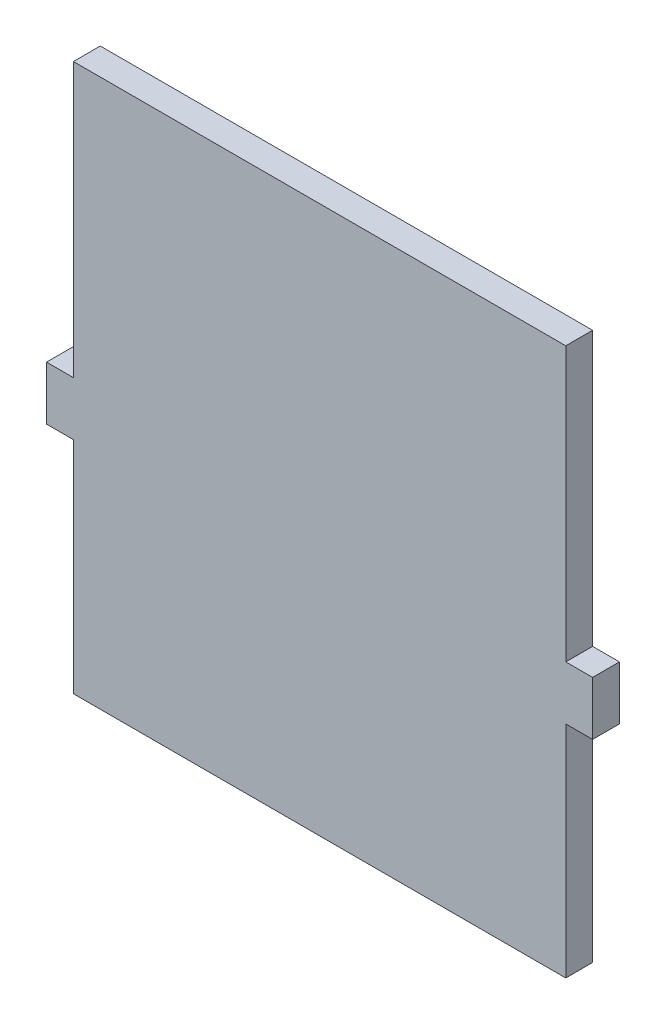
ISO-10303-21;
HEADER;
FILE_DESCRIPTION(('STEP AP214'),'2;1');
FILE_NAME('part.step','',(''),(''),'','','');
FILE_SCHEMA(('AUTOMOTIVE_DESIGN { 1 0 10303 214 1 1 1 1 }'));
ENDSEC;
DATA;
#1=APPLICATION_CONTEXT('core data for automotive mechanical design processes');
#2=APPLICATION_PROTOCOL_DEFINITION('international standard','automotive_design',2000,#1);
#3=PRODUCT_CONTEXT('',#1,'mechanical');
#4=PRODUCT('Part','Part','',(#3));
#5=PRODUCT_RELATED_PRODUCT_CATEGORY('part','',(#4));
#6=PRODUCT_DEFINITION_FORMATION('','',#4);
#7=PRODUCT_DEFINITION_CONTEXT('part definition',#1,'design');
#8=PRODUCT_DEFINITION('design','',#6,#7);
#9=PRODUCT_DEFINITION_SHAPE('','',#8);
#10=(LENGTH_UNIT() NAMED_UNIT(*) SI_UNIT(.MILLI.,.METRE.));
#11=(NAMED_UNIT(*) PLANE_ANGLE_UNIT() SI_UNIT($,.RADIAN.));
#12=(NAMED_UNIT(*) SI_UNIT($,.STERADIAN.) SOLID_ANGLE_UNIT());
#13=UNCERTAINTY_MEASURE_WITH_UNIT(LENGTH_MEASURE(1.E-05),#10,'distance_accuracy_value','');
#14=(GEOMETRIC_REPRESENTATION_CONTEXT(3) GLOBAL_UNCERTAINTY_ASSIGNED_CONTEXT((#13)) GLOBAL_UNIT_ASSIGNED_CONTEXT((#10,
#11,#12)) REPRESENTATION_CONTEXT('',''));
#15=CARTESIAN_POINT('',(0.,0.,0.));
#16=DIRECTION('',(0.,0.,1.));
#17=DIRECTION('',(1.,0.,0.));
#18=AXIS2_PLACEMENT_3D('',#15,#16,#17);
#19=CARTESIAN_POINT('',(0.,0.,3.));
#20=DIRECTION('',(1.,0.,0.));
#21=DIRECTION('',(0.,1.,0.));
#22=AXIS2_PLACEMENT_3D('',#19,#20,#21);
#23=PLANE('',#22);
#24=DIRECTION('',(0.,-1.,0.));
#25=VECTOR('',#24,1.);
#26=CARTESIAN_POINT('',(0.,0.,0.));
#27=LINE('',#26,#25);
#28=CARTESIAN_POINT('',(0.,0.,0.));
#29=VERTEX_POINT('',#28);
#30=CARTESIAN_POINT('',(0.,-30.58,0.));
#31=VERTEX_POINT('',#30);
#32=EDGE_CURVE('E159',#29,#31,#27,.T.);
#33=ORIENTED_EDGE('',*,*,#32,.T.);
#34=DIRECTION('',(0.,0.,-1.));
#35=VECTOR('',#34,1.);
#36=CARTESIAN_POINT('',(0.,-30.58,3.));
#37=LINE('',#36,#35);
#38=CARTESIAN_POINT('',(0.,-30.58,3.));
#39=VERTEX_POINT('',#38);
#40=EDGE_CURVE('E11',#39,#31,#37,.T.);
#41=ORIENTED_EDGE('',*,*,#40,.F.);
#42=DIRECTION('',(0.,-1.,0.));
#43=VECTOR('',#42,1.);
#44=CARTESIAN_POINT('',(0.,0.,3.));
#45=LINE('',#44,#43);
#46=CARTESIAN_POINT('',(0.,0.,3.));
#47=VERTEX_POINT('',#46);
#48=EDGE_CURVE('E181',#47,#39,#45,.T.);
#49=ORIENTED_EDGE('',*,*,#48,.F.);
#50=DIRECTION('',(0.,0.,-1.));
#51=VECTOR('',#50,1.);
#52=CARTESIAN_POINT('',(0.,0.,3.));
#53=LINE('',#52,#51);
#54=EDGE_CURVE('E155',#47,#29,#53,.T.);
#55=ORIENTED_EDGE('',*,*,#54,.T.);
#56=EDGE_LOOP('',(#33,#41,#49,#55));
#57=FACE_BOUND('',#56,.T.);
#58=ADVANCED_FACE('F39',(#57),#23,.F.);
#59=CARTESIAN_POINT('',(0.,-30.58,3.));
#60=DIRECTION('',(0.,-1.,0.));
#61=DIRECTION('',(0.,0.,-1.));
#62=AXIS2_PLACEMENT_3D('',#59,#60,#61);
#63=PLANE('',#62);
#64=DIRECTION('',(-1.,0.,0.));
#65=VECTOR('',#64,1.);
#66=CARTESIAN_POINT('',(0.,-30.58,0.));
#67=LINE('',#66,#65);
#68=CARTESIAN_POINT('',(-2.99999999999999,-30.58,0.));
#69=VERTEX_POINT('',#68);
#70=EDGE_CURVE('E162',#31,#69,#67,.T.);
#71=ORIENTED_EDGE('',*,*,#70,.T.);
#72=DIRECTION('',(0.,0.,-1.));
#73=VECTOR('',#72,1.);
#74=CARTESIAN_POINT('',(-2.99999999999999,-30.58,3.));
#75=LINE('',#74,#73);
#76=CARTESIAN_POINT('',(-2.99999999999999,-30.58,3.));
#77=VERTEX_POINT('',#76);
#78=EDGE_CURVE('E47',#77,#69,#75,.T.);
#79=ORIENTED_EDGE('',*,*,#78,.F.);
#80=DIRECTION('',(-1.,0.,0.));
#81=VECTOR('',#80,1.);
#82=CARTESIAN_POINT('',(0.,-30.58,3.));
#83=LINE('',#82,#81);
#84=EDGE_CURVE('E110',#39,#77,#83,.T.);
#85=ORIENTED_EDGE('',*,*,#84,.F.);
#86=ORIENTED_EDGE('',*,*,#40,.T.);
#87=EDGE_LOOP('',(#71,#79,#85,#86));
#88=FACE_BOUND('',#87,.T.);
#89=ADVANCED_FACE('F259',(#88),#63,.F.);
#90=CARTESIAN_POINT('',(-2.99999999999999,-30.58,3.));
#91=DIRECTION('',(1.,0.,0.));
#92=DIRECTION('',(0.,1.,0.));
#93=AXIS2_PLACEMENT_3D('',#90,#91,#92);
#94=PLANE('',#93);
#95=DIRECTION('',(0.,-1.,0.));
#96=VECTOR('',#95,1.);
#97=CARTESIAN_POINT('',(-2.99999999999999,-30.58,0.));
#98=LINE('',#97,#96);
#99=CARTESIAN_POINT('',(-2.99999999999999,-36.58,0.));
#100=VERTEX_POINT('',#99);
#101=EDGE_CURVE('E164',#69,#100,#98,.T.);
#102=ORIENTED_EDGE('',*,*,#101,.T.);
#103=DIRECTION('',(0.,0.,-1.));
#104=VECTOR('',#103,1.);
#105=CARTESIAN_POINT('',(-2.99999999999999,-36.58,3.));
#106=LINE('',#105,#104);
#107=CARTESIAN_POINT('',(-2.99999999999999,-36.58,3.));
#108=VERTEX_POINT('',#107);
#109=EDGE_CURVE('E200',#108,#100,#106,.T.);
#110=ORIENTED_EDGE('',*,*,#109,.F.);
#111=DIRECTION('',(0.,-1.,0.));
#112=VECTOR('',#111,1.);
#113=CARTESIAN_POINT('',(-2.99999999999999,-30.58,3.));
#114=LINE('',#113,#112);
#115=EDGE_CURVE('E208',#77,#108,#114,.T.);
#116=ORIENTED_EDGE('',*,*,#115,.F.);
#117=ORIENTED_EDGE('',*,*,#78,.T.);
#118=EDGE_LOOP('',(#102,#110,#116,#117));
#119=FACE_BOUND('',#118,.T.);
#120=ADVANCED_FACE('F206',(#119),#94,.F.);
#121=CARTESIAN_POINT('',(0.,-36.58,3.));
#122=DIRECTION('',(0.,1.,0.));
#123=DIRECTION('',(0.,0.,1.));
#124=AXIS2_PLACEMENT_3D('',#121,#122,#123);
#125=PLANE('',#124);
#126=DIRECTION('',(1.,0.,0.));
#127=VECTOR('',#126,1.);
#128=CARTESIAN_POINT('',(0.,-36.58,0.));
#129=LINE('',#128,#127);
#130=CARTESIAN_POINT('',(0.,-36.58,0.));
#131=VERTEX_POINT('',#130);
#132=EDGE_CURVE('E166',#100,#131,#129,.T.);
#133=ORIENTED_EDGE('',*,*,#132,.T.);
#134=DIRECTION('',(0.,0.,-1.));
#135=VECTOR('',#134,1.);
#136=CARTESIAN_POINT('',(0.,-36.58,3.));
#137=LINE('',#136,#135);
#138=CARTESIAN_POINT('',(0.,-36.58,3.));
#139=VERTEX_POINT('',#138);
#140=EDGE_CURVE('E197',#139,#131,#137,.T.);
#141=ORIENTED_EDGE('',*,*,#140,.F.);
#142=DIRECTION('',(1.,0.,0.));
#143=VECTOR('',#142,1.);
#144=CARTESIAN_POINT('',(0.,-36.58,3.));
#145=LINE('',#144,#143);
#146=EDGE_CURVE('E226',#108,#139,#145,.T.);
#147=ORIENTED_EDGE('',*,*,#146,.F.);
#148=ORIENTED_EDGE('',*,*,#109,.T.);
#149=EDGE_LOOP('',(#133,#141,#147,#148));
#150=FACE_BOUND('',#149,.T.);
#151=ADVANCED_FACE('F217',(#150),#125,.F.);
#152=CARTESIAN_POINT('',(0.,-36.58,3.));
#153=DIRECTION('',(1.,0.,0.));
#154=DIRECTION('',(0.,1.,0.));
#155=AXIS2_PLACEMENT_3D('',#152,#153,#154);
#156=PLANE('',#155);
#157=DIRECTION('',(0.,-1.,0.));
#158=VECTOR('',#157,1.);
#159=CARTESIAN_POINT('',(0.,-36.58,0.));
#160=LINE('',#159,#158);
#161=CARTESIAN_POINT('',(0.,-61.16,0.));
#162=VERTEX_POINT('',#161);
#163=EDGE_CURVE('E168',#131,#162,#160,.T.);
#164=ORIENTED_EDGE('',*,*,#163,.T.);
#165=DIRECTION('',(0.,0.,-1.));
#166=VECTOR('',#165,1.);
#167=CARTESIAN_POINT('',(0.,-61.16,3.));
#168=LINE('',#167,#166);
#169=CARTESIAN_POINT('',(0.,-61.16,3.));
#170=VERTEX_POINT('',#169);
#171=EDGE_CURVE('E194',#170,#162,#168,.T.);
#172=ORIENTED_EDGE('',*,*,#171,.F.);
#173=DIRECTION('',(0.,-1.,0.));
#174=VECTOR('',#173,1.);
#175=CARTESIAN_POINT('',(0.,-36.58,3.));
#176=LINE('',#175,#174);
#177=EDGE_CURVE('E223',#139,#170,#176,.T.);
#178=ORIENTED_EDGE('',*,*,#177,.F.);
#179=ORIENTED_EDGE('',*,*,#140,.T.);
#180=EDGE_LOOP('',(#164,#172,#178,#179));
#181=FACE_BOUND('',#180,.T.);
#182=ADVANCED_FACE('F221',(#181),#156,.F.);
#183=CARTESIAN_POINT('',(0.,-61.16,3.));
#184=DIRECTION('',(0.,1.,0.));
#185=DIRECTION('',(-1.,0.,0.));
#186=AXIS2_PLACEMENT_3D('',#183,#184,#185);
#187=PLANE('',#186);
#188=DIRECTION('',(1.,0.,0.));
#189=VECTOR('',#188,1.);
#190=CARTESIAN_POINT('',(0.,-61.16,0.));
#191=LINE('',#190,#189);
#192=CARTESIAN_POINT('',(55.,-61.16,0.));
#193=VERTEX_POINT('',#192);
#194=EDGE_CURVE('E170',#162,#193,#191,.T.);
#195=ORIENTED_EDGE('',*,*,#194,.T.);
#196=DIRECTION('',(0.,0.,-1.));
#197=VECTOR('',#196,1.);
#198=CARTESIAN_POINT('',(55.,-61.16,3.));
#199=LINE('',#198,#197);
#200=CARTESIAN_POINT('',(55.,-61.16,3.));
#201=VERTEX_POINT('',#200);
#202=EDGE_CURVE('E191',#201,#193,#199,.T.);
#203=ORIENTED_EDGE('',*,*,#202,.F.);
#204=DIRECTION('',(1.,0.,0.));
#205=VECTOR('',#204,1.);
#206=CARTESIAN_POINT('',(0.,-61.16,3.));
#207=LINE('',#206,#205);
#208=EDGE_CURVE('E225',#170,#201,#207,.T.);
#209=ORIENTED_EDGE('',*,*,#208,.F.);
#210=ORIENTED_EDGE('',*,*,#171,.T.);
#211=EDGE_LOOP('',(#195,#203,#209,#210));
#212=FACE_BOUND('',#211,.T.);
#213=ADVANCED_FACE('F272',(#212),#187,.F.);
#214=CARTESIAN_POINT('',(55.,-36.58,3.));
#215=DIRECTION('',(-1.,0.,0.));
#216=DIRECTION('',(0.,0.,1.));
#217=AXIS2_PLACEMENT_3D('',#214,#215,#216);
#218=PLANE('',#217);
#219=DIRECTION('',(0.,1.,0.));
#220=VECTOR('',#219,1.);
#221=CARTESIAN_POINT('',(55.,-36.58,0.));
#222=LINE('',#221,#220);
#223=CARTESIAN_POINT('',(55.,-36.58,0.));
#224=VERTEX_POINT('',#223);
#225=EDGE_CURVE('E172',#193,#224,#222,.T.);
#226=ORIENTED_EDGE('',*,*,#225,.T.);
#227=DIRECTION('',(0.,0.,-1.));
#228=VECTOR('',#227,1.);
#229=CARTESIAN_POINT('',(55.,-36.58,3.));
#230=LINE('',#229,#228);
#231=CARTESIAN_POINT('',(55.,-36.58,3.));
#232=VERTEX_POINT('',#231);
#233=EDGE_CURVE('E188',#232,#224,#230,.T.);
#234=ORIENTED_EDGE('',*,*,#233,.F.);
#235=DIRECTION('',(0.,1.,0.));
#236=VECTOR('',#235,1.);
#237=CARTESIAN_POINT('',(55.,-36.58,3.));
#238=LINE('',#237,#236);
#239=EDGE_CURVE('E228',#201,#232,#238,.T.);
#240=ORIENTED_EDGE('',*,*,#239,.F.);
#241=ORIENTED_EDGE('',*,*,#202,.T.);
#242=EDGE_LOOP('',(#226,#234,#240,#241));
#243=FACE_BOUND('',#242,.T.);
#244=ADVANCED_FACE('F275',(#243),#218,.F.);
#245=CARTESIAN_POINT('',(55.,-36.58,3.));
#246=DIRECTION('',(0.,1.,0.));
#247=DIRECTION('',(0.,0.,1.));
#248=AXIS2_PLACEMENT_3D('',#245,#246,#247);
#249=PLANE('',#248);
#250=DIRECTION('',(1.,0.,0.));
#251=VECTOR('',#250,1.);
#252=CARTESIAN_POINT('',(55.,-36.58,0.));
#253=LINE('',#252,#251);
#254=CARTESIAN_POINT('',(58.,-36.58,0.));
#255=VERTEX_POINT('',#254);
#256=EDGE_CURVE('E174',#224,#255,#253,.T.);
#257=ORIENTED_EDGE('',*,*,#256,.T.);
#258=DIRECTION('',(0.,0.,-1.));
#259=VECTOR('',#258,1.);
#260=CARTESIAN_POINT('',(58.,-36.58,3.));
#261=LINE('',#260,#259);
#262=CARTESIAN_POINT('',(58.,-36.58,3.));
#263=VERTEX_POINT('',#262);
#264=EDGE_CURVE('E185',#263,#255,#261,.T.);
#265=ORIENTED_EDGE('',*,*,#264,.F.);
#266=DIRECTION('',(1.,0.,0.));
#267=VECTOR('',#266,1.);
#268=CARTESIAN_POINT('',(55.,-36.58,3.));
#269=LINE('',#268,#267);
#270=EDGE_CURVE('E234',#232,#263,#269,.T.);
#271=ORIENTED_EDGE('',*,*,#270,.F.);
#272=ORIENTED_EDGE('',*,*,#233,.T.);
#273=EDGE_LOOP('',(#257,#265,#271,#272));
#274=FACE_BOUND('',#273,.T.);
#275=ADVANCED_FACE('F240',(#274),#249,.F.);
#276=CARTESIAN_POINT('',(58.,-30.58,3.));
#277=DIRECTION('',(-1.,0.,0.));
#278=DIRECTION('',(0.,-1.,0.));
#279=AXIS2_PLACEMENT_3D('',#276,#277,#278);
#280=PLANE('',#279);
#281=DIRECTION('',(0.,1.,0.));
#282=VECTOR('',#281,1.);
#283=CARTESIAN_POINT('',(58.,-30.58,0.));
#284=LINE('',#283,#282);
#285=CARTESIAN_POINT('',(58.,-30.58,0.));
#286=VERTEX_POINT('',#285);
#287=EDGE_CURVE('E176',#255,#286,#284,.T.);
#288=ORIENTED_EDGE('',*,*,#287,.T.);
#289=DIRECTION('',(0.,0.,-1.));
#290=VECTOR('',#289,1.);
#291=CARTESIAN_POINT('',(58.,-30.58,3.));
#292=LINE('',#291,#290);
#293=CARTESIAN_POINT('',(58.,-30.58,3.));
#294=VERTEX_POINT('',#293);
#295=EDGE_CURVE('E150',#294,#286,#292,.T.);
#296=ORIENTED_EDGE('',*,*,#295,.F.);
#297=DIRECTION('',(0.,1.,0.));
#298=VECTOR('',#297,1.);
#299=CARTESIAN_POINT('',(58.,-30.58,3.));
#300=LINE('',#299,#298);
#301=EDGE_CURVE('E141',#263,#294,#300,.T.);
#302=ORIENTED_EDGE('',*,*,#301,.F.);
#303=ORIENTED_EDGE('',*,*,#264,.T.);
#304=EDGE_LOOP('',(#288,#296,#302,#303));
#305=FACE_BOUND('',#304,.T.);
#306=ADVANCED_FACE('F244',(#305),#280,.F.);
#307=CARTESIAN_POINT('',(55.,-30.58,3.));
#308=DIRECTION('',(0.,-1.,0.));
#309=DIRECTION('',(0.,0.,-1.));
#310=AXIS2_PLACEMENT_3D('',#307,#308,#309);
#311=PLANE('',#310);
#312=DIRECTION('',(-1.,0.,0.));
#313=VECTOR('',#312,1.);
#314=CARTESIAN_POINT('',(55.,-30.58,0.));
#315=LINE('',#314,#313);
#316=CARTESIAN_POINT('',(55.,-30.58,0.));
#317=VERTEX_POINT('',#316);
#318=EDGE_CURVE('E149',#286,#317,#315,.T.);
#319=ORIENTED_EDGE('',*,*,#318,.T.);
#320=DIRECTION('',(0.,0.,-1.));
#321=VECTOR('',#320,1.);
#322=CARTESIAN_POINT('',(55.,-30.58,3.));
#323=LINE('',#322,#321);
#324=CARTESIAN_POINT('',(55.,-30.58,3.));
#325=VERTEX_POINT('',#324);
#326=EDGE_CURVE('E146',#325,#317,#323,.T.);
#327=ORIENTED_EDGE('',*,*,#326,.F.);
#328=DIRECTION('',(-1.,0.,0.));
#329=VECTOR('',#328,1.);
#330=CARTESIAN_POINT('',(55.,-30.58,3.));
#331=LINE('',#330,#329);
#332=EDGE_CURVE('E135',#294,#325,#331,.T.);
#333=ORIENTED_EDGE('',*,*,#332,.F.);
#334=ORIENTED_EDGE('',*,*,#295,.T.);
#335=EDGE_LOOP('',(#319,#327,#333,#334));
#336=FACE_BOUND('',#335,.T.);
#337=ADVANCED_FACE('F147',(#336),#311,.F.);
#338=CARTESIAN_POINT('',(55.,0.,3.));
#339=DIRECTION('',(-1.,0.,0.));
#340=DIRECTION('',(0.,0.,1.));
#341=AXIS2_PLACEMENT_3D('',#338,#339,#340);
#342=PLANE('',#341);
#343=DIRECTION('',(0.,1.,0.));
#344=VECTOR('',#343,1.);
#345=CARTESIAN_POINT('',(55.,0.,0.));
#346=LINE('',#345,#344);
#347=CARTESIAN_POINT('',(55.,0.,0.));
#348=VERTEX_POINT('',#347);
#349=EDGE_CURVE('E96',#317,#348,#346,.T.);
#350=ORIENTED_EDGE('',*,*,#349,.T.);
#351=DIRECTION('',(0.,0.,-1.));
#352=VECTOR('',#351,1.);
#353=CARTESIAN_POINT('',(55.,0.,3.));
#354=LINE('',#353,#352);
#355=CARTESIAN_POINT('',(55.,0.,3.));
#356=VERTEX_POINT('',#355);
#357=EDGE_CURVE('E151',#356,#348,#354,.T.);
#358=ORIENTED_EDGE('',*,*,#357,.F.);
#359=DIRECTION('',(0.,1.,0.));
#360=VECTOR('',#359,1.);
#361=CARTESIAN_POINT('',(55.,0.,3.));
#362=LINE('',#361,#360);
#363=EDGE_CURVE('E139',#325,#356,#362,.T.);
#364=ORIENTED_EDGE('',*,*,#363,.F.);
#365=ORIENTED_EDGE('',*,*,#326,.T.);
#366=EDGE_LOOP('',(#350,#358,#364,#365));
#367=FACE_BOUND('',#366,.T.);
#368=ADVANCED_FACE('F153',(#367),#342,.F.);
#369=CARTESIAN_POINT('',(0.,0.,3.));
#370=DIRECTION('',(0.,-1.,0.));
#371=DIRECTION('',(0.,0.,-1.));
#372=AXIS2_PLACEMENT_3D('',#369,#370,#371);
#373=PLANE('',#372);
#374=DIRECTION('',(-1.,0.,0.));
#375=VECTOR('',#374,1.);
#376=CARTESIAN_POINT('',(0.,0.,0.));
#377=LINE('',#376,#375);
#378=EDGE_CURVE('E102',#348,#29,#377,.T.);
#379=ORIENTED_EDGE('',*,*,#378,.T.);
#380=ORIENTED_EDGE('',*,*,#54,.F.);
#381=DIRECTION('',(-1.,0.,0.));
#382=VECTOR('',#381,1.);
#383=CARTESIAN_POINT('',(0.,0.,3.));
#384=LINE('',#383,#382);
#385=EDGE_CURVE('E55',#356,#47,#384,.T.);
#386=ORIENTED_EDGE('',*,*,#385,.F.);
#387=ORIENTED_EDGE('',*,*,#357,.T.);
#388=EDGE_LOOP('',(#379,#380,#386,#387));
#389=FACE_BOUND('',#388,.T.);
#390=ADVANCED_FACE('F248',(#389),#373,.F.);
#391=CARTESIAN_POINT('',(0.,0.,3.));
#392=DIRECTION('',(0.,0.,-1.));
#393=DIRECTION('',(-1.,0.,0.));
#394=AXIS2_PLACEMENT_3D('',#391,#392,#393);
#395=PLANE('',#394);
#396=ORIENTED_EDGE('',*,*,#48,.T.);
#397=ORIENTED_EDGE('',*,*,#84,.T.);
#398=ORIENTED_EDGE('',*,*,#115,.T.);
#399=ORIENTED_EDGE('',*,*,#146,.T.);
#400=ORIENTED_EDGE('',*,*,#177,.T.);
#401=ORIENTED_EDGE('',*,*,#208,.T.);
#402=ORIENTED_EDGE('',*,*,#239,.T.);
#403=ORIENTED_EDGE('',*,*,#270,.T.);
#404=ORIENTED_EDGE('',*,*,#301,.T.);
#405=ORIENTED_EDGE('',*,*,#332,.T.);
#406=ORIENTED_EDGE('',*,*,#363,.T.);
#407=ORIENTED_EDGE('',*,*,#385,.T.);
#408=EDGE_LOOP('',(#396,#397,#398,#399,#400,#401,#402,#403,#404,#405,#406,#407));
#409=FACE_BOUND('',#408,.T.);
#410=ADVANCED_FACE('F137',(#409),#395,.F.);
#411=CARTESIAN_POINT('',(0.,0.,0.));
#412=DIRECTION('',(0.,0.,-1.));
#413=DIRECTION('',(-1.,0.,0.));
#414=AXIS2_PLACEMENT_3D('',#411,#412,#413);
#415=PLANE('',#414);
#416=ORIENTED_EDGE('',*,*,#32,.F.);
#417=ORIENTED_EDGE('',*,*,#378,.F.);
#418=ORIENTED_EDGE('',*,*,#349,.F.);
#419=ORIENTED_EDGE('',*,*,#318,.F.);
#420=ORIENTED_EDGE('',*,*,#287,.F.);
#421=ORIENTED_EDGE('',*,*,#256,.F.);
#422=ORIENTED_EDGE('',*,*,#225,.F.);
#423=ORIENTED_EDGE('',*,*,#194,.F.);
#424=ORIENTED_EDGE('',*,*,#163,.F.);
#425=ORIENTED_EDGE('',*,*,#132,.F.);
#426=ORIENTED_EDGE('',*,*,#101,.F.);
#427=ORIENTED_EDGE('',*,*,#70,.F.);
#428=EDGE_LOOP('',(#416,#417,#418,#419,#420,#421,#422,#423,#424,#425,#426,#427));
#429=FACE_BOUND('',#428,.T.);
#430=ADVANCED_FACE('F212',(#429),#415,.T.);
#431=CLOSED_SHELL('',(#58,#89,#120,#151,#182,#213,#244,#275,#306,#337,#368,#390,#410,#430));
#432=MANIFOLD_SOLID_BREP('B2',#431);
#433=ADVANCED_BREP_SHAPE_REPRESENTATION('',(#18,#432),#14);
#434=SHAPE_DEFINITION_REPRESENTATION(#9,#433);
ENDSEC;
END-ISO-10303-21;
